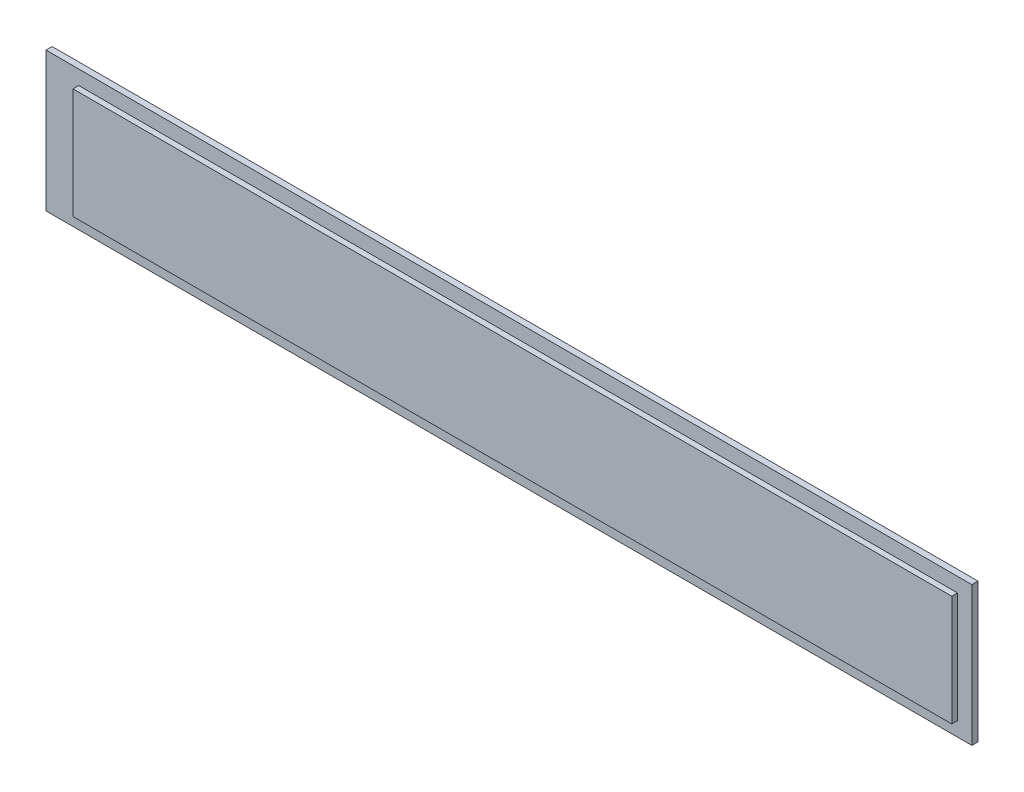
ISO-10303-21;
HEADER;
FILE_DESCRIPTION(('STEP AP214'),'2;1');
FILE_NAME('part.step','',(''),(''),'','','');
FILE_SCHEMA(('AUTOMOTIVE_DESIGN { 1 0 10303 214 1 1 1 1 }'));
ENDSEC;
DATA;
#1=APPLICATION_CONTEXT('core data for automotive mechanical design processes');
#2=APPLICATION_PROTOCOL_DEFINITION('international standard','automotive_design',2000,#1);
#3=PRODUCT_CONTEXT('',#1,'mechanical');
#4=PRODUCT('Part','Part','',(#3));
#5=PRODUCT_RELATED_PRODUCT_CATEGORY('part','',(#4));
#6=PRODUCT_DEFINITION_FORMATION('','',#4);
#7=PRODUCT_DEFINITION_CONTEXT('part definition',#1,'design');
#8=PRODUCT_DEFINITION('design','',#6,#7);
#9=PRODUCT_DEFINITION_SHAPE('','',#8);
#10=(LENGTH_UNIT() NAMED_UNIT(*) SI_UNIT(.MILLI.,.METRE.));
#11=(NAMED_UNIT(*) PLANE_ANGLE_UNIT() SI_UNIT($,.RADIAN.));
#12=(NAMED_UNIT(*) SI_UNIT($,.STERADIAN.) SOLID_ANGLE_UNIT());
#13=UNCERTAINTY_MEASURE_WITH_UNIT(LENGTH_MEASURE(1.E-05),#10,'distance_accuracy_value','');
#14=(GEOMETRIC_REPRESENTATION_CONTEXT(3) GLOBAL_UNCERTAINTY_ASSIGNED_CONTEXT((#13)) GLOBAL_UNIT_ASSIGNED_CONTEXT((#10,
#11,#12)) REPRESENTATION_CONTEXT('',''));
#15=CARTESIAN_POINT('',(0.,0.,0.));
#16=DIRECTION('',(0.,0.,1.));
#17=DIRECTION('',(1.,0.,0.));
#18=AXIS2_PLACEMENT_3D('',#15,#16,#17);
#19=CARTESIAN_POINT('',(221.,-12.9,0.1));
#20=DIRECTION('',(0.,-1.,0.));
#21=DIRECTION('',(1.,0.,0.));
#22=AXIS2_PLACEMENT_3D('',#19,#20,#21);
#23=PLANE('',#22);
#24=DIRECTION('',(0.,0.,-1.));
#25=VECTOR('',#24,1.);
#26=CARTESIAN_POINT('',(-5.,-12.9,0.1));
#27=LINE('',#26,#25);
#28=CARTESIAN_POINT('',(-5.,-12.9,0.1));
#29=VERTEX_POINT('',#28);
#30=CARTESIAN_POINT('',(-5.,-12.9,-1.4));
#31=VERTEX_POINT('',#30);
#32=EDGE_CURVE('E68',#29,#31,#27,.T.);
#33=ORIENTED_EDGE('',*,*,#32,.T.);
#34=DIRECTION('',(-1.,0.,0.));
#35=VECTOR('',#34,1.);
#36=CARTESIAN_POINT('',(-5.,-12.9,-1.4));
#37=LINE('',#36,#35);
#38=CARTESIAN_POINT('',(221.,-12.9,-1.4));
#39=VERTEX_POINT('',#38);
#40=EDGE_CURVE('E157',#39,#31,#37,.T.);
#41=ORIENTED_EDGE('',*,*,#40,.F.);
#42=DIRECTION('',(0.,0.,-1.));
#43=VECTOR('',#42,1.);
#44=CARTESIAN_POINT('',(221.,-12.9,0.1));
#45=LINE('',#44,#43);
#46=CARTESIAN_POINT('',(221.,-12.9,0.1));
#47=VERTEX_POINT('',#46);
#48=EDGE_CURVE('E12',#47,#39,#45,.T.);
#49=ORIENTED_EDGE('',*,*,#48,.F.);
#50=DIRECTION('',(-1.,0.,0.));
#51=VECTOR('',#50,1.);
#52=CARTESIAN_POINT('',(221.,-12.9,0.1));
#53=LINE('',#52,#51);
#54=EDGE_CURVE('E180',#47,#29,#53,.T.);
#55=ORIENTED_EDGE('',*,*,#54,.T.);
#56=EDGE_LOOP('',(#33,#41,#49,#55));
#57=FACE_BOUND('',#56,.T.);
#58=ADVANCED_FACE('F65',(#57),#23,.T.);
#59=CARTESIAN_POINT('',(221.,21.1,0.1));
#60=DIRECTION('',(1.,0.,0.));
#61=DIRECTION('',(0.,0.,-1.));
#62=AXIS2_PLACEMENT_3D('',#59,#60,#61);
#63=PLANE('',#62);
#64=ORIENTED_EDGE('',*,*,#48,.T.);
#65=DIRECTION('',(0.,-1.,0.));
#66=VECTOR('',#65,1.);
#67=CARTESIAN_POINT('',(221.,-12.9,-1.4));
#68=LINE('',#67,#66);
#69=CARTESIAN_POINT('',(221.,21.1,-1.4));
#70=VERTEX_POINT('',#69);
#71=EDGE_CURVE('E154',#70,#39,#68,.T.);
#72=ORIENTED_EDGE('',*,*,#71,.F.);
#73=DIRECTION('',(0.,0.,-1.));
#74=VECTOR('',#73,1.);
#75=CARTESIAN_POINT('',(221.,21.1,0.1));
#76=LINE('',#75,#74);
#77=CARTESIAN_POINT('',(221.,21.1,0.1));
#78=VERTEX_POINT('',#77);
#79=EDGE_CURVE('E73',#78,#70,#76,.T.);
#80=ORIENTED_EDGE('',*,*,#79,.F.);
#81=DIRECTION('',(0.,-1.,0.));
#82=VECTOR('',#81,1.);
#83=CARTESIAN_POINT('',(221.,21.1,0.1));
#84=LINE('',#83,#82);
#85=EDGE_CURVE('E187',#78,#47,#84,.T.);
#86=ORIENTED_EDGE('',*,*,#85,.T.);
#87=EDGE_LOOP('',(#64,#72,#80,#86));
#88=FACE_BOUND('',#87,.T.);
#89=ADVANCED_FACE('F207',(#88),#63,.T.);
#90=CARTESIAN_POINT('',(-5.00000000000001,21.1,0.1));
#91=DIRECTION('',(0.,1.,0.));
#92=DIRECTION('',(-1.,0.,0.));
#93=AXIS2_PLACEMENT_3D('',#90,#91,#92);
#94=PLANE('',#93);
#95=ORIENTED_EDGE('',*,*,#79,.T.);
#96=DIRECTION('',(1.,0.,0.));
#97=VECTOR('',#96,1.);
#98=CARTESIAN_POINT('',(221.,21.1,-1.4));
#99=LINE('',#98,#97);
#100=CARTESIAN_POINT('',(-5.00000000000001,21.1,-1.4));
#101=VERTEX_POINT('',#100);
#102=EDGE_CURVE('E168',#101,#70,#99,.T.);
#103=ORIENTED_EDGE('',*,*,#102,.F.);
#104=DIRECTION('',(0.,0.,-1.));
#105=VECTOR('',#104,1.);
#106=CARTESIAN_POINT('',(-5.00000000000001,21.1,0.1));
#107=LINE('',#106,#105);
#108=CARTESIAN_POINT('',(-5.00000000000001,21.1,0.1));
#109=VERTEX_POINT('',#108);
#110=EDGE_CURVE('E189',#109,#101,#107,.T.);
#111=ORIENTED_EDGE('',*,*,#110,.F.);
#112=DIRECTION('',(1.,0.,0.));
#113=VECTOR('',#112,1.);
#114=CARTESIAN_POINT('',(-5.00000000000001,21.1,0.1));
#115=LINE('',#114,#113);
#116=EDGE_CURVE('E185',#109,#78,#115,.T.);
#117=ORIENTED_EDGE('',*,*,#116,.T.);
#118=EDGE_LOOP('',(#95,#103,#111,#117));
#119=FACE_BOUND('',#118,.T.);
#120=ADVANCED_FACE('F199',(#119),#94,.T.);
#121=CARTESIAN_POINT('',(-5.,-12.9,0.1));
#122=DIRECTION('',(-1.,0.,0.));
#123=DIRECTION('',(0.,-1.,0.));
#124=AXIS2_PLACEMENT_3D('',#121,#122,#123);
#125=PLANE('',#124);
#126=ORIENTED_EDGE('',*,*,#110,.T.);
#127=DIRECTION('',(0.,1.,0.));
#128=VECTOR('',#127,1.);
#129=CARTESIAN_POINT('',(-5.00000000000001,21.1,-1.4));
#130=LINE('',#129,#128);
#131=EDGE_CURVE('E165',#31,#101,#130,.T.);
#132=ORIENTED_EDGE('',*,*,#131,.F.);
#133=ORIENTED_EDGE('',*,*,#32,.F.);
#134=DIRECTION('',(0.,1.,0.));
#135=VECTOR('',#134,1.);
#136=CARTESIAN_POINT('',(-5.,-12.9,0.1));
#137=LINE('',#136,#135);
#138=EDGE_CURVE('E182',#29,#109,#137,.T.);
#139=ORIENTED_EDGE('',*,*,#138,.T.);
#140=EDGE_LOOP('',(#126,#132,#133,#139));
#141=FACE_BOUND('',#140,.T.);
#142=ADVANCED_FACE('F196',(#141),#125,.T.);
#143=CARTESIAN_POINT('',(0.,0.,0.1));
#144=DIRECTION('',(0.,0.,-1.));
#145=DIRECTION('',(-1.,0.,0.));
#146=AXIS2_PLACEMENT_3D('',#143,#144,#145);
#147=PLANE('',#146);
#148=DIRECTION('',(0.,-1.,0.));
#149=VECTOR('',#148,1.);
#150=CARTESIAN_POINT('',(217.5,17.6,0.1));
#151=LINE('',#150,#149);
#152=CARTESIAN_POINT('',(217.5,17.6,0.1));
#153=VERTEX_POINT('',#152);
#154=CARTESIAN_POINT('',(217.5,-9.40000000000003,0.1));
#155=VERTEX_POINT('',#154);
#156=EDGE_CURVE('E177',#153,#155,#151,.T.);
#157=ORIENTED_EDGE('',*,*,#156,.T.);
#158=DIRECTION('',(-1.,0.,0.));
#159=VECTOR('',#158,1.);
#160=CARTESIAN_POINT('',(217.5,-9.40000000000003,0.1));
#161=LINE('',#160,#159);
#162=CARTESIAN_POINT('',(3.,-9.40000000000003,0.1));
#163=VERTEX_POINT('',#162);
#164=EDGE_CURVE('E171',#155,#163,#161,.T.);
#165=ORIENTED_EDGE('',*,*,#164,.T.);
#166=DIRECTION('',(0.,1.,0.));
#167=VECTOR('',#166,1.);
#168=CARTESIAN_POINT('',(3.,-9.40000000000003,0.1));
#169=LINE('',#168,#167);
#170=CARTESIAN_POINT('',(3.,17.6,0.1));
#171=VERTEX_POINT('',#170);
#172=EDGE_CURVE('E153',#163,#171,#169,.T.);
#173=ORIENTED_EDGE('',*,*,#172,.T.);
#174=DIRECTION('',(1.,0.,0.));
#175=VECTOR('',#174,1.);
#176=CARTESIAN_POINT('',(3.,17.6,0.1));
#177=LINE('',#176,#175);
#178=EDGE_CURVE('E174',#171,#153,#177,.T.);
#179=ORIENTED_EDGE('',*,*,#178,.T.);
#180=EDGE_LOOP('',(#157,#165,#173,#179));
#181=FACE_BOUND('',#180,.T.);
#182=ORIENTED_EDGE('',*,*,#54,.F.);
#183=ORIENTED_EDGE('',*,*,#85,.F.);
#184=ORIENTED_EDGE('',*,*,#116,.F.);
#185=ORIENTED_EDGE('',*,*,#138,.F.);
#186=EDGE_LOOP('',(#182,#183,#184,#185));
#187=FACE_BOUND('',#186,.T.);
#188=ADVANCED_FACE('F198',(#181,#187),#147,.F.);
#189=CARTESIAN_POINT('',(0.,0.,-1.4));
#190=DIRECTION('',(0.,0.,1.));
#191=DIRECTION('',(1.,0.,0.));
#192=AXIS2_PLACEMENT_3D('',#189,#190,#191);
#193=PLANE('',#192);
#194=ORIENTED_EDGE('',*,*,#71,.T.);
#195=ORIENTED_EDGE('',*,*,#40,.T.);
#196=ORIENTED_EDGE('',*,*,#131,.T.);
#197=ORIENTED_EDGE('',*,*,#102,.T.);
#198=EDGE_LOOP('',(#194,#195,#196,#197));
#199=FACE_BOUND('',#198,.T.);
#200=ADVANCED_FACE('F194',(#199),#193,.F.);
#201=CARTESIAN_POINT('',(3.,-9.40000000000003,1.5));
#202=DIRECTION('',(1.,0.,0.));
#203=DIRECTION('',(0.,1.,0.));
#204=AXIS2_PLACEMENT_3D('',#201,#202,#203);
#205=PLANE('',#204);
#206=DIRECTION('',(0.,0.,-1.));
#207=VECTOR('',#206,1.);
#208=CARTESIAN_POINT('',(3.,17.6,1.5));
#209=LINE('',#208,#207);
#210=CARTESIAN_POINT('',(3.,17.6,1.5));
#211=VERTEX_POINT('',#210);
#212=EDGE_CURVE('E306',#211,#171,#209,.T.);
#213=ORIENTED_EDGE('',*,*,#212,.T.);
#214=ORIENTED_EDGE('',*,*,#172,.F.);
#215=DIRECTION('',(0.,0.,-1.));
#216=VECTOR('',#215,1.);
#217=CARTESIAN_POINT('',(3.,-9.40000000000003,1.5));
#218=LINE('',#217,#216);
#219=CARTESIAN_POINT('',(3.,-9.40000000000003,1.5));
#220=VERTEX_POINT('',#219);
#221=EDGE_CURVE('E134',#220,#163,#218,.T.);
#222=ORIENTED_EDGE('',*,*,#221,.F.);
#223=DIRECTION('',(0.,-1.,0.));
#224=VECTOR('',#223,1.);
#225=CARTESIAN_POINT('',(3.,-9.40000000000003,1.5));
#226=LINE('',#225,#224);
#227=EDGE_CURVE('E141',#211,#220,#226,.T.);
#228=ORIENTED_EDGE('',*,*,#227,.F.);
#229=EDGE_LOOP('',(#213,#214,#222,#228));
#230=FACE_BOUND('',#229,.T.);
#231=ADVANCED_FACE('F151',(#230),#205,.F.);
#232=CARTESIAN_POINT('',(217.5,-9.40000000000003,1.5));
#233=DIRECTION('',(0.,1.,0.));
#234=DIRECTION('',(0.,0.,1.));
#235=AXIS2_PLACEMENT_3D('',#232,#233,#234);
#236=PLANE('',#235);
#237=ORIENTED_EDGE('',*,*,#221,.T.);
#238=ORIENTED_EDGE('',*,*,#164,.F.);
#239=DIRECTION('',(0.,0.,-1.));
#240=VECTOR('',#239,1.);
#241=CARTESIAN_POINT('',(217.5,-9.40000000000003,1.5));
#242=LINE('',#241,#240);
#243=CARTESIAN_POINT('',(217.5,-9.40000000000003,1.5));
#244=VERTEX_POINT('',#243);
#245=EDGE_CURVE('E137',#244,#155,#242,.T.);
#246=ORIENTED_EDGE('',*,*,#245,.F.);
#247=DIRECTION('',(1.,0.,0.));
#248=VECTOR('',#247,1.);
#249=CARTESIAN_POINT('',(217.5,-9.40000000000003,1.5));
#250=LINE('',#249,#248);
#251=EDGE_CURVE('E130',#220,#244,#250,.T.);
#252=ORIENTED_EDGE('',*,*,#251,.F.);
#253=EDGE_LOOP('',(#237,#238,#246,#252));
#254=FACE_BOUND('',#253,.T.);
#255=ADVANCED_FACE('F132',(#254),#236,.F.);
#256=CARTESIAN_POINT('',(217.5,17.6,1.5));
#257=DIRECTION('',(-1.,0.,0.));
#258=DIRECTION('',(0.,0.,1.));
#259=AXIS2_PLACEMENT_3D('',#256,#257,#258);
#260=PLANE('',#259);
#261=ORIENTED_EDGE('',*,*,#245,.T.);
#262=ORIENTED_EDGE('',*,*,#156,.F.);
#263=DIRECTION('',(0.,0.,-1.));
#264=VECTOR('',#263,1.);
#265=CARTESIAN_POINT('',(217.5,17.6,1.5));
#266=LINE('',#265,#264);
#267=CARTESIAN_POINT('',(217.5,17.6,1.5));
#268=VERTEX_POINT('',#267);
#269=EDGE_CURVE('E159',#268,#153,#266,.T.);
#270=ORIENTED_EDGE('',*,*,#269,.F.);
#271=DIRECTION('',(0.,1.,0.));
#272=VECTOR('',#271,1.);
#273=CARTESIAN_POINT('',(217.5,17.6,1.5));
#274=LINE('',#273,#272);
#275=EDGE_CURVE('E140',#244,#268,#274,.T.);
#276=ORIENTED_EDGE('',*,*,#275,.F.);
#277=EDGE_LOOP('',(#261,#262,#270,#276));
#278=FACE_BOUND('',#277,.T.);
#279=ADVANCED_FACE('F223',(#278),#260,.F.);
#280=CARTESIAN_POINT('',(3.,17.6,1.5));
#281=DIRECTION('',(0.,-1.,0.));
#282=DIRECTION('',(0.,0.,-1.));
#283=AXIS2_PLACEMENT_3D('',#280,#281,#282);
#284=PLANE('',#283);
#285=ORIENTED_EDGE('',*,*,#269,.T.);
#286=ORIENTED_EDGE('',*,*,#178,.F.);
#287=ORIENTED_EDGE('',*,*,#212,.F.);
#288=DIRECTION('',(-1.,0.,0.));
#289=VECTOR('',#288,1.);
#290=CARTESIAN_POINT('',(3.,17.6,1.5));
#291=LINE('',#290,#289);
#292=EDGE_CURVE('E146',#268,#211,#291,.T.);
#293=ORIENTED_EDGE('',*,*,#292,.F.);
#294=EDGE_LOOP('',(#285,#286,#287,#293));
#295=FACE_BOUND('',#294,.T.);
#296=ADVANCED_FACE('F226',(#295),#284,.F.);
#297=CARTESIAN_POINT('',(0.,0.,1.5));
#298=DIRECTION('',(0.,0.,-1.));
#299=DIRECTION('',(-1.,0.,0.));
#300=AXIS2_PLACEMENT_3D('',#297,#298,#299);
#301=PLANE('',#300);
#302=ORIENTED_EDGE('',*,*,#227,.T.);
#303=ORIENTED_EDGE('',*,*,#251,.T.);
#304=ORIENTED_EDGE('',*,*,#275,.T.);
#305=ORIENTED_EDGE('',*,*,#292,.T.);
#306=EDGE_LOOP('',(#302,#303,#304,#305));
#307=FACE_BOUND('',#306,.T.);
#308=ADVANCED_FACE('F144',(#307),#301,.F.);
#309=CLOSED_SHELL('',(#58,#89,#120,#142,#188,#200,#231,#255,#279,#296,#308));
#310=MANIFOLD_SOLID_BREP('B2',#309);
#311=ADVANCED_BREP_SHAPE_REPRESENTATION('',(#18,#310),#14);
#312=SHAPE_DEFINITION_REPRESENTATION(#9,#311);
ENDSEC;
END-ISO-10303-21;
